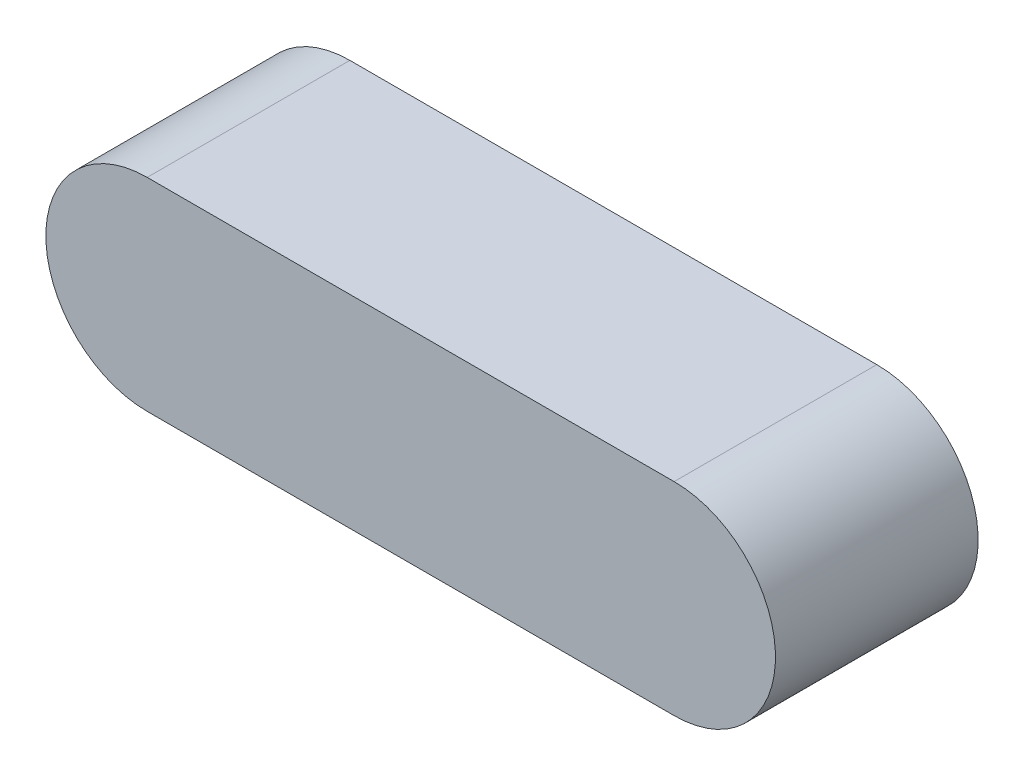
ISO-10303-21;
HEADER;
FILE_DESCRIPTION(('STEP AP214'),'2;1');
FILE_NAME('part.step','',(''),(''),'','','');
FILE_SCHEMA(('AUTOMOTIVE_DESIGN { 1 0 10303 214 1 1 1 1 }'));
ENDSEC;
DATA;
#1=APPLICATION_CONTEXT('core data for automotive mechanical design processes');
#2=APPLICATION_PROTOCOL_DEFINITION('international standard','automotive_design',2000,#1);
#3=PRODUCT_CONTEXT('',#1,'mechanical');
#4=PRODUCT('Part','Part','',(#3));
#5=PRODUCT_RELATED_PRODUCT_CATEGORY('part','',(#4));
#6=PRODUCT_DEFINITION_FORMATION('','',#4);
#7=PRODUCT_DEFINITION_CONTEXT('part definition',#1,'design');
#8=PRODUCT_DEFINITION('design','',#6,#7);
#9=PRODUCT_DEFINITION_SHAPE('','',#8);
#10=(LENGTH_UNIT() NAMED_UNIT(*) SI_UNIT(.MILLI.,.METRE.));
#11=(NAMED_UNIT(*) PLANE_ANGLE_UNIT() SI_UNIT($,.RADIAN.));
#12=(NAMED_UNIT(*) SI_UNIT($,.STERADIAN.) SOLID_ANGLE_UNIT());
#13=UNCERTAINTY_MEASURE_WITH_UNIT(LENGTH_MEASURE(1.E-05),#10,'distance_accuracy_value','');
#14=(GEOMETRIC_REPRESENTATION_CONTEXT(3) GLOBAL_UNCERTAINTY_ASSIGNED_CONTEXT((#13)) GLOBAL_UNIT_ASSIGNED_CONTEXT((#10,
#11,#12)) REPRESENTATION_CONTEXT('',''));
#15=CARTESIAN_POINT('',(0.,0.,0.));
#16=DIRECTION('',(0.,0.,1.));
#17=DIRECTION('',(1.,0.,0.));
#18=AXIS2_PLACEMENT_3D('',#15,#16,#17);
#19=CARTESIAN_POINT('',(0.,-2.5,5.));
#20=DIRECTION('',(0.,0.,-1.));
#21=DIRECTION('',(-1.,0.,0.));
#22=AXIS2_PLACEMENT_3D('',#19,#20,#21);
#23=CYLINDRICAL_SURFACE('',#22,2.5);
#24=CARTESIAN_POINT('',(0.,-2.5,0.));
#25=DIRECTION('',(0.,0.,1.));
#26=DIRECTION('',(-1.,0.,0.));
#27=AXIS2_PLACEMENT_3D('',#24,#25,#26);
#28=CIRCLE('',#27,2.5);
#29=CARTESIAN_POINT('',(0.,0.,0.));
#30=VERTEX_POINT('',#29);
#31=CARTESIAN_POINT('',(0.,-5.00000000000001,0.));
#32=VERTEX_POINT('',#31);
#33=EDGE_CURVE('E76',#30,#32,#28,.T.);
#34=ORIENTED_EDGE('',*,*,#33,.T.);
#35=DIRECTION('',(0.,0.,-1.));
#36=VECTOR('',#35,1.);
#37=CARTESIAN_POINT('',(0.,-5.00000000000001,5.));
#38=LINE('',#37,#36);
#39=CARTESIAN_POINT('',(0.,-5.00000000000001,5.));
#40=VERTEX_POINT('',#39);
#41=EDGE_CURVE('E11',#40,#32,#38,.T.);
#42=ORIENTED_EDGE('',*,*,#41,.F.);
#43=CARTESIAN_POINT('',(0.,-2.5,5.));
#44=DIRECTION('',(0.,0.,1.));
#45=DIRECTION('',(-1.,0.,0.));
#46=AXIS2_PLACEMENT_3D('',#43,#44,#45);
#47=CIRCLE('',#46,2.5);
#48=CARTESIAN_POINT('',(0.,0.,5.));
#49=VERTEX_POINT('',#48);
#50=EDGE_CURVE('E94',#49,#40,#47,.T.);
#51=ORIENTED_EDGE('',*,*,#50,.F.);
#52=DIRECTION('',(0.,0.,-1.));
#53=VECTOR('',#52,1.);
#54=CARTESIAN_POINT('',(0.,0.,5.));
#55=LINE('',#54,#53);
#56=EDGE_CURVE('E88',#49,#30,#55,.T.);
#57=ORIENTED_EDGE('',*,*,#56,.T.);
#58=EDGE_LOOP('',(#34,#42,#51,#57));
#59=FACE_BOUND('',#58,.T.);
#60=ADVANCED_FACE('F32',(#59),#23,.T.);
#61=CARTESIAN_POINT('',(13.,-5.00000000000001,5.));
#62=DIRECTION('',(0.,1.,0.));
#63=DIRECTION('',(-1.,0.,0.));
#64=AXIS2_PLACEMENT_3D('',#61,#62,#63);
#65=PLANE('',#64);
#66=DIRECTION('',(1.,0.,0.));
#67=VECTOR('',#66,1.);
#68=CARTESIAN_POINT('',(13.,-5.00000000000001,0.));
#69=LINE('',#68,#67);
#70=CARTESIAN_POINT('',(13.,-5.,0.));
#71=VERTEX_POINT('',#70);
#72=EDGE_CURVE('E72',#32,#71,#69,.T.);
#73=ORIENTED_EDGE('',*,*,#72,.T.);
#74=DIRECTION('',(0.,0.,-1.));
#75=VECTOR('',#74,1.);
#76=CARTESIAN_POINT('',(13.,-5.,5.));
#77=LINE('',#76,#75);
#78=CARTESIAN_POINT('',(13.,-5.,5.));
#79=VERTEX_POINT('',#78);
#80=EDGE_CURVE('E39',#79,#71,#77,.T.);
#81=ORIENTED_EDGE('',*,*,#80,.F.);
#82=DIRECTION('',(1.,0.,0.));
#83=VECTOR('',#82,1.);
#84=CARTESIAN_POINT('',(13.,-5.00000000000001,5.));
#85=LINE('',#84,#83);
#86=EDGE_CURVE('E84',#40,#79,#85,.T.);
#87=ORIENTED_EDGE('',*,*,#86,.F.);
#88=ORIENTED_EDGE('',*,*,#41,.T.);
#89=EDGE_LOOP('',(#73,#81,#87,#88));
#90=FACE_BOUND('',#89,.T.);
#91=ADVANCED_FACE('F83',(#90),#65,.F.);
#92=CARTESIAN_POINT('',(13.,-2.5,5.));
#93=DIRECTION('',(0.,0.,-1.));
#94=DIRECTION('',(-1.,0.,0.));
#95=AXIS2_PLACEMENT_3D('',#92,#93,#94);
#96=CYLINDRICAL_SURFACE('',#95,2.5);
#97=CARTESIAN_POINT('',(13.,-2.5,0.));
#98=DIRECTION('',(0.,0.,1.));
#99=DIRECTION('',(-1.,0.,0.));
#100=AXIS2_PLACEMENT_3D('',#97,#98,#99);
#101=CIRCLE('',#100,2.5);
#102=CARTESIAN_POINT('',(13.,0.,0.));
#103=VERTEX_POINT('',#102);
#104=EDGE_CURVE('E77',#71,#103,#101,.T.);
#105=ORIENTED_EDGE('',*,*,#104,.T.);
#106=DIRECTION('',(0.,0.,-1.));
#107=VECTOR('',#106,1.);
#108=CARTESIAN_POINT('',(13.,0.,5.));
#109=LINE('',#108,#107);
#110=CARTESIAN_POINT('',(13.,0.,5.));
#111=VERTEX_POINT('',#110);
#112=EDGE_CURVE('E100',#111,#103,#109,.T.);
#113=ORIENTED_EDGE('',*,*,#112,.F.);
#114=CARTESIAN_POINT('',(13.,-2.5,5.));
#115=DIRECTION('',(0.,0.,1.));
#116=DIRECTION('',(-1.,0.,0.));
#117=AXIS2_PLACEMENT_3D('',#114,#115,#116);
#118=CIRCLE('',#117,2.5);
#119=EDGE_CURVE('E51',#79,#111,#118,.T.);
#120=ORIENTED_EDGE('',*,*,#119,.F.);
#121=ORIENTED_EDGE('',*,*,#80,.T.);
#122=EDGE_LOOP('',(#105,#113,#120,#121));
#123=FACE_BOUND('',#122,.T.);
#124=ADVANCED_FACE('F103',(#123),#96,.T.);
#125=CARTESIAN_POINT('',(0.,0.,5.));
#126=DIRECTION('',(0.,-1.,0.));
#127=DIRECTION('',(0.,0.,-1.));
#128=AXIS2_PLACEMENT_3D('',#125,#126,#127);
#129=PLANE('',#128);
#130=DIRECTION('',(-1.,0.,0.));
#131=VECTOR('',#130,1.);
#132=CARTESIAN_POINT('',(0.,0.,0.));
#133=LINE('',#132,#131);
#134=EDGE_CURVE('E92',#103,#30,#133,.T.);
#135=ORIENTED_EDGE('',*,*,#134,.T.);
#136=ORIENTED_EDGE('',*,*,#56,.F.);
#137=DIRECTION('',(-1.,0.,0.));
#138=VECTOR('',#137,1.);
#139=CARTESIAN_POINT('',(0.,0.,5.));
#140=LINE('',#139,#138);
#141=EDGE_CURVE('E46',#111,#49,#140,.T.);
#142=ORIENTED_EDGE('',*,*,#141,.F.);
#143=ORIENTED_EDGE('',*,*,#112,.T.);
#144=EDGE_LOOP('',(#135,#136,#142,#143));
#145=FACE_BOUND('',#144,.T.);
#146=ADVANCED_FACE('F105',(#145),#129,.F.);
#147=CARTESIAN_POINT('',(0.,-2.5,5.));
#148=DIRECTION('',(0.,0.,-1.));
#149=DIRECTION('',(-1.,0.,0.));
#150=AXIS2_PLACEMENT_3D('',#147,#148,#149);
#151=PLANE('',#150);
#152=ORIENTED_EDGE('',*,*,#50,.T.);
#153=ORIENTED_EDGE('',*,*,#86,.T.);
#154=ORIENTED_EDGE('',*,*,#119,.T.);
#155=ORIENTED_EDGE('',*,*,#141,.T.);
#156=EDGE_LOOP('',(#152,#153,#154,#155));
#157=FACE_BOUND('',#156,.T.);
#158=ADVANCED_FACE('F106',(#157),#151,.F.);
#159=CARTESIAN_POINT('',(0.,-2.5,0.));
#160=DIRECTION('',(0.,0.,-1.));
#161=DIRECTION('',(-1.,0.,0.));
#162=AXIS2_PLACEMENT_3D('',#159,#160,#161);
#163=PLANE('',#162);
#164=ORIENTED_EDGE('',*,*,#33,.F.);
#165=ORIENTED_EDGE('',*,*,#134,.F.);
#166=ORIENTED_EDGE('',*,*,#104,.F.);
#167=ORIENTED_EDGE('',*,*,#72,.F.);
#168=EDGE_LOOP('',(#164,#165,#166,#167));
#169=FACE_BOUND('',#168,.T.);
#170=ADVANCED_FACE('F73',(#169),#163,.T.);
#171=CLOSED_SHELL('',(#60,#91,#124,#146,#158,#170));
#172=MANIFOLD_SOLID_BREP('B2',#171);
#173=ADVANCED_BREP_SHAPE_REPRESENTATION('',(#18,#172),#14);
#174=SHAPE_DEFINITION_REPRESENTATION(#9,#173);
ENDSEC;
END-ISO-10303-21;
